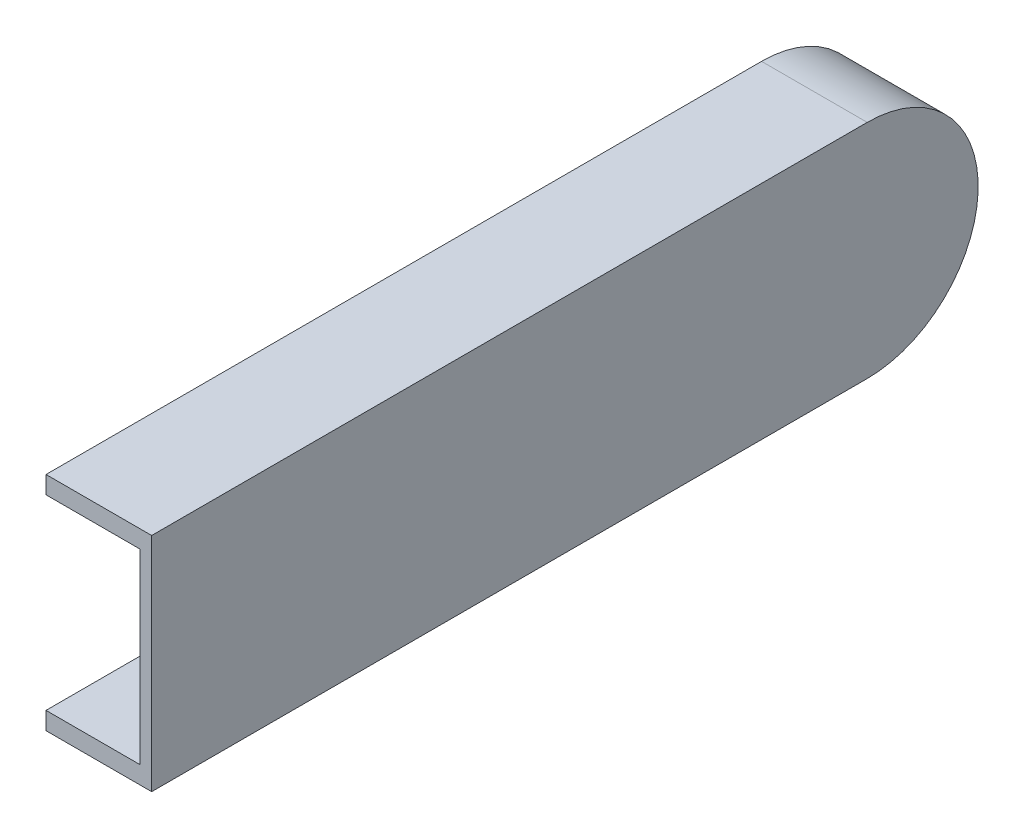
ISO-10303-21;
HEADER;
FILE_DESCRIPTION(('STEP AP214'),'2;1');
FILE_NAME('part.step','',(''),(''),'','','');
FILE_SCHEMA(('AUTOMOTIVE_DESIGN { 1 0 10303 214 1 1 1 1 }'));
ENDSEC;
DATA;
#1=APPLICATION_CONTEXT('core data for automotive mechanical design processes');
#2=APPLICATION_PROTOCOL_DEFINITION('international standard','automotive_design',2000,#1);
#3=PRODUCT_CONTEXT('',#1,'mechanical');
#4=PRODUCT('Part','Part','',(#3));
#5=PRODUCT_RELATED_PRODUCT_CATEGORY('part','',(#4));
#6=PRODUCT_DEFINITION_FORMATION('','',#4);
#7=PRODUCT_DEFINITION_CONTEXT('part definition',#1,'design');
#8=PRODUCT_DEFINITION('design','',#6,#7);
#9=PRODUCT_DEFINITION_SHAPE('','',#8);
#10=(LENGTH_UNIT() NAMED_UNIT(*) SI_UNIT(.MILLI.,.METRE.));
#11=(NAMED_UNIT(*) PLANE_ANGLE_UNIT() SI_UNIT($,.RADIAN.));
#12=(NAMED_UNIT(*) SI_UNIT($,.STERADIAN.) SOLID_ANGLE_UNIT());
#13=UNCERTAINTY_MEASURE_WITH_UNIT(LENGTH_MEASURE(1.E-05),#10,'distance_accuracy_value','');
#14=(GEOMETRIC_REPRESENTATION_CONTEXT(3) GLOBAL_UNCERTAINTY_ASSIGNED_CONTEXT((#13)) GLOBAL_UNIT_ASSIGNED_CONTEXT((#10,
#11,#12)) REPRESENTATION_CONTEXT('',''));
#15=CARTESIAN_POINT('',(0.,0.,0.));
#16=DIRECTION('',(0.,0.,1.));
#17=DIRECTION('',(1.,0.,0.));
#18=AXIS2_PLACEMENT_3D('',#15,#16,#17);
#19=CARTESIAN_POINT('',(0.,0.,30.474082362107));
#20=DIRECTION('',(1.,0.,0.));
#21=DIRECTION('',(0.,0.,-1.));
#22=AXIS2_PLACEMENT_3D('',#19,#20,#21);
#23=PLANE('',#22);
#24=DIRECTION('',(0.,0.,-1.));
#25=VECTOR('',#24,1.);
#26=CARTESIAN_POINT('',(0.,-9.45000000000007,30.474082362107));
#27=LINE('',#26,#25);
#28=CARTESIAN_POINT('',(0.,-9.45000000000007,30.4740823621069));
#29=VERTEX_POINT('',#28);
#30=CARTESIAN_POINT('',(0.,-9.45000000000001,-30.474082362107));
#31=VERTEX_POINT('',#30);
#32=EDGE_CURVE('E121',#29,#31,#27,.T.);
#33=ORIENTED_EDGE('',*,*,#32,.F.);
#34=DIRECTION('',(0.,1.,0.));
#35=VECTOR('',#34,1.);
#36=CARTESIAN_POINT('',(0.,9.45000000000004,30.4740823621069));
#37=LINE('',#36,#35);
#38=CARTESIAN_POINT('',(0.,-7.95000000000007,30.4740823621069));
#39=VERTEX_POINT('',#38);
#40=EDGE_CURVE('E108',#29,#39,#37,.T.);
#41=ORIENTED_EDGE('',*,*,#40,.T.);
#42=DIRECTION('',(0.,0.,-1.));
#43=VECTOR('',#42,1.);
#44=CARTESIAN_POINT('',(0.,-7.95000000000007,30.474082362107));
#45=LINE('',#44,#43);
#46=CARTESIAN_POINT('',(0.,-7.95000000000001,-30.474082362107));
#47=VERTEX_POINT('',#46);
#48=EDGE_CURVE('E146',#39,#47,#45,.T.);
#49=ORIENTED_EDGE('',*,*,#48,.T.);
#50=CARTESIAN_POINT('',(0.,0.,-30.474082362107));
#51=DIRECTION('',(1.,0.,0.));
#52=DIRECTION('',(0.,0.,-1.));
#53=AXIS2_PLACEMENT_3D('',#50,#51,#52);
#54=CIRCLE('',#53,7.95000000000001);
#55=CARTESIAN_POINT('',(0.,7.95000000000002,-30.474082362107));
#56=VERTEX_POINT('',#55);
#57=EDGE_CURVE('E157',#47,#56,#54,.T.);
#58=ORIENTED_EDGE('',*,*,#57,.T.);
#59=DIRECTION('',(0.,0.,1.));
#60=VECTOR('',#59,1.);
#61=CARTESIAN_POINT('',(0.,7.95000000000002,-30.474082362107));
#62=LINE('',#61,#60);
#63=CARTESIAN_POINT('',(0.,7.95000000000007,30.4740823621069));
#64=VERTEX_POINT('',#63);
#65=EDGE_CURVE('E151',#56,#64,#62,.T.);
#66=ORIENTED_EDGE('',*,*,#65,.T.);
#67=CARTESIAN_POINT('',(0.,9.45000000000004,30.4740823621069));
#68=VERTEX_POINT('',#67);
#69=EDGE_CURVE('E119',#64,#68,#37,.T.);
#70=ORIENTED_EDGE('',*,*,#69,.T.);
#71=DIRECTION('',(0.,0.,1.));
#72=VECTOR('',#71,1.);
#73=CARTESIAN_POINT('',(0.,9.45000000000002,-30.474082362107));
#74=LINE('',#73,#72);
#75=CARTESIAN_POINT('',(0.,9.45000000000002,-30.474082362107));
#76=VERTEX_POINT('',#75);
#77=EDGE_CURVE('E170',#76,#68,#74,.T.);
#78=ORIENTED_EDGE('',*,*,#77,.F.);
#79=CARTESIAN_POINT('',(0.,0.,-30.474082362107));
#80=DIRECTION('',(1.,0.,0.));
#81=DIRECTION('',(0.,0.,-1.));
#82=AXIS2_PLACEMENT_3D('',#79,#80,#81);
#83=CIRCLE('',#82,9.45000000000001);
#84=EDGE_CURVE('E66',#31,#76,#83,.T.);
#85=ORIENTED_EDGE('',*,*,#84,.F.);
#86=EDGE_LOOP('',(#33,#41,#49,#58,#66,#70,#78,#85));
#87=FACE_BOUND('',#86,.T.);
#88=ADVANCED_FACE('F41',(#87),#23,.F.);
#89=CARTESIAN_POINT('',(8.,-9.45000000000007,30.474082362107));
#90=DIRECTION('',(0.,1.,0.));
#91=DIRECTION('',(0.,0.,1.));
#92=AXIS2_PLACEMENT_3D('',#89,#90,#91);
#93=PLANE('',#92);
#94=ORIENTED_EDGE('',*,*,#32,.T.);
#95=DIRECTION('',(-1.,0.,0.));
#96=VECTOR('',#95,1.);
#97=CARTESIAN_POINT('',(8.,-9.45000000000001,-30.474082362107));
#98=LINE('',#97,#96);
#99=CARTESIAN_POINT('',(9.,-9.45000000000001,-30.474082362107));
#100=VERTEX_POINT('',#99);
#101=EDGE_CURVE('E128',#100,#31,#98,.T.);
#102=ORIENTED_EDGE('',*,*,#101,.F.);
#103=DIRECTION('',(0.,0.,-1.));
#104=VECTOR('',#103,1.);
#105=CARTESIAN_POINT('',(9.,-9.45000000000007,30.474082362107));
#106=LINE('',#105,#104);
#107=CARTESIAN_POINT('',(9.000012,-9.45000000000007,30.4740823621069));
#108=VERTEX_POINT('',#107);
#109=EDGE_CURVE('E127',#108,#100,#106,.T.);
#110=ORIENTED_EDGE('',*,*,#109,.F.);
#111=DIRECTION('',(-1.,0.,0.));
#112=VECTOR('',#111,1.);
#113=CARTESIAN_POINT('',(8.,-9.45000000000007,30.474082362107));
#114=LINE('',#113,#112);
#115=EDGE_CURVE('E50',#108,#29,#114,.T.);
#116=ORIENTED_EDGE('',*,*,#115,.T.);
#117=EDGE_LOOP('',(#94,#102,#110,#116));
#118=FACE_BOUND('',#117,.T.);
#119=ADVANCED_FACE('F43',(#118),#93,.F.);
#120=CARTESIAN_POINT('',(8.,0.,-30.474082362107));
#121=DIRECTION('',(-1.,0.,0.));
#122=DIRECTION('',(0.,0.,1.));
#123=AXIS2_PLACEMENT_3D('',#120,#121,#122);
#124=CYLINDRICAL_SURFACE('',#123,9.45000000000001);
#125=ORIENTED_EDGE('',*,*,#84,.T.);
#126=DIRECTION('',(-1.,0.,0.));
#127=VECTOR('',#126,1.);
#128=CARTESIAN_POINT('',(8.,9.45000000000002,-30.474082362107));
#129=LINE('',#128,#127);
#130=CARTESIAN_POINT('',(9.,9.45000000000002,-30.474082362107));
#131=VERTEX_POINT('',#130);
#132=EDGE_CURVE('E130',#131,#76,#129,.T.);
#133=ORIENTED_EDGE('',*,*,#132,.F.);
#134=CARTESIAN_POINT('',(9.,0.,-30.474082362107));
#135=DIRECTION('',(1.,0.,0.));
#136=DIRECTION('',(0.,0.,-1.));
#137=AXIS2_PLACEMENT_3D('',#134,#135,#136);
#138=CIRCLE('',#137,9.45000000000001);
#139=EDGE_CURVE('E135',#100,#131,#138,.T.);
#140=ORIENTED_EDGE('',*,*,#139,.F.);
#141=ORIENTED_EDGE('',*,*,#101,.T.);
#142=EDGE_LOOP('',(#125,#133,#140,#141));
#143=FACE_BOUND('',#142,.T.);
#144=ADVANCED_FACE('F199',(#143),#124,.T.);
#145=CARTESIAN_POINT('',(8.,9.45000000000002,-30.474082362107));
#146=DIRECTION('',(0.,-1.,0.));
#147=DIRECTION('',(0.,0.,-1.));
#148=AXIS2_PLACEMENT_3D('',#145,#146,#147);
#149=PLANE('',#148);
#150=ORIENTED_EDGE('',*,*,#77,.T.);
#151=DIRECTION('',(-1.,0.,0.));
#152=VECTOR('',#151,1.);
#153=CARTESIAN_POINT('',(8.,9.45000000000007,30.474082362107));
#154=LINE('',#153,#152);
#155=CARTESIAN_POINT('',(9.,9.45000000000004,30.4740823621069));
#156=VERTEX_POINT('',#155);
#157=EDGE_CURVE('E173',#156,#68,#154,.T.);
#158=ORIENTED_EDGE('',*,*,#157,.F.);
#159=DIRECTION('',(0.,0.,1.));
#160=VECTOR('',#159,1.);
#161=CARTESIAN_POINT('',(9.,9.45000000000002,-30.474082362107));
#162=LINE('',#161,#160);
#163=EDGE_CURVE('E139',#131,#156,#162,.T.);
#164=ORIENTED_EDGE('',*,*,#163,.F.);
#165=ORIENTED_EDGE('',*,*,#132,.T.);
#166=EDGE_LOOP('',(#150,#158,#164,#165));
#167=FACE_BOUND('',#166,.T.);
#168=ADVANCED_FACE('F178',(#167),#149,.F.);
#169=CARTESIAN_POINT('',(8.,-7.95000000000007,30.474082362107));
#170=DIRECTION('',(0.,1.,0.));
#171=DIRECTION('',(0.,0.,1.));
#172=AXIS2_PLACEMENT_3D('',#169,#170,#171);
#173=PLANE('',#172);
#174=ORIENTED_EDGE('',*,*,#48,.F.);
#175=DIRECTION('',(-1.,0.,0.));
#176=VECTOR('',#175,1.);
#177=CARTESIAN_POINT('',(8.,-7.95000000000007,30.474082362107));
#178=LINE('',#177,#176);
#179=CARTESIAN_POINT('',(8.,-7.95000000000007,30.4740823621069));
#180=VERTEX_POINT('',#179);
#181=EDGE_CURVE('E114',#180,#39,#178,.T.);
#182=ORIENTED_EDGE('',*,*,#181,.F.);
#183=DIRECTION('',(0.,0.,-1.));
#184=VECTOR('',#183,1.);
#185=CARTESIAN_POINT('',(8.,-7.95000000000007,30.474082362107));
#186=LINE('',#185,#184);
#187=CARTESIAN_POINT('',(8.,-7.95000000000001,-30.474082362107));
#188=VERTEX_POINT('',#187);
#189=EDGE_CURVE('E147',#180,#188,#186,.T.);
#190=ORIENTED_EDGE('',*,*,#189,.T.);
#191=DIRECTION('',(-1.,0.,0.));
#192=VECTOR('',#191,1.);
#193=CARTESIAN_POINT('',(8.,-7.95000000000001,-30.474082362107));
#194=LINE('',#193,#192);
#195=EDGE_CURVE('E166',#188,#47,#194,.T.);
#196=ORIENTED_EDGE('',*,*,#195,.T.);
#197=EDGE_LOOP('',(#174,#182,#190,#196));
#198=FACE_BOUND('',#197,.T.);
#199=ADVANCED_FACE('F190',(#198),#173,.T.);
#200=CARTESIAN_POINT('',(8.,0.,-30.474082362107));
#201=DIRECTION('',(-1.,0.,0.));
#202=DIRECTION('',(0.,0.,1.));
#203=AXIS2_PLACEMENT_3D('',#200,#201,#202);
#204=CYLINDRICAL_SURFACE('',#203,7.95000000000001);
#205=ORIENTED_EDGE('',*,*,#57,.F.);
#206=ORIENTED_EDGE('',*,*,#195,.F.);
#207=CARTESIAN_POINT('',(8.,0.,-30.474082362107));
#208=DIRECTION('',(1.,0.,0.));
#209=DIRECTION('',(0.,0.,-1.));
#210=AXIS2_PLACEMENT_3D('',#207,#208,#209);
#211=CIRCLE('',#210,7.95000000000001);
#212=CARTESIAN_POINT('',(8.,7.95000000000002,-30.474082362107));
#213=VERTEX_POINT('',#212);
#214=EDGE_CURVE('E150',#188,#213,#211,.T.);
#215=ORIENTED_EDGE('',*,*,#214,.T.);
#216=DIRECTION('',(-1.,0.,0.));
#217=VECTOR('',#216,1.);
#218=CARTESIAN_POINT('',(8.,7.95000000000002,-30.474082362107));
#219=LINE('',#218,#217);
#220=EDGE_CURVE('E164',#213,#56,#219,.T.);
#221=ORIENTED_EDGE('',*,*,#220,.T.);
#222=EDGE_LOOP('',(#205,#206,#215,#221));
#223=FACE_BOUND('',#222,.T.);
#224=ADVANCED_FACE('F187',(#223),#204,.F.);
#225=CARTESIAN_POINT('',(8.,7.95000000000002,-30.474082362107));
#226=DIRECTION('',(0.,-1.,0.));
#227=DIRECTION('',(0.,0.,-1.));
#228=AXIS2_PLACEMENT_3D('',#225,#226,#227);
#229=PLANE('',#228);
#230=ORIENTED_EDGE('',*,*,#65,.F.);
#231=ORIENTED_EDGE('',*,*,#220,.F.);
#232=DIRECTION('',(0.,0.,1.));
#233=VECTOR('',#232,1.);
#234=CARTESIAN_POINT('',(8.,7.95000000000002,-30.474082362107));
#235=LINE('',#234,#233);
#236=CARTESIAN_POINT('',(8.,7.95000000000007,30.4740823621069));
#237=VERTEX_POINT('',#236);
#238=EDGE_CURVE('E58',#213,#237,#235,.T.);
#239=ORIENTED_EDGE('',*,*,#238,.T.);
#240=DIRECTION('',(-1.,0.,0.));
#241=VECTOR('',#240,1.);
#242=CARTESIAN_POINT('',(8.,7.95000000000007,30.474082362107));
#243=LINE('',#242,#241);
#244=EDGE_CURVE('E155',#237,#64,#243,.T.);
#245=ORIENTED_EDGE('',*,*,#244,.T.);
#246=EDGE_LOOP('',(#230,#231,#239,#245));
#247=FACE_BOUND('',#246,.T.);
#248=ADVANCED_FACE('F183',(#247),#229,.T.);
#249=CARTESIAN_POINT('',(8.,0.,30.474082362107));
#250=DIRECTION('',(1.,0.,0.));
#251=DIRECTION('',(0.,0.,-1.));
#252=AXIS2_PLACEMENT_3D('',#249,#250,#251);
#253=PLANE('',#252);
#254=ORIENTED_EDGE('',*,*,#189,.F.);
#255=DIRECTION('',(0.,1.,0.));
#256=VECTOR('',#255,1.);
#257=CARTESIAN_POINT('',(8.,0.,30.4740823621069));
#258=LINE('',#257,#256);
#259=EDGE_CURVE('E118',#180,#237,#258,.T.);
#260=ORIENTED_EDGE('',*,*,#259,.T.);
#261=ORIENTED_EDGE('',*,*,#238,.F.);
#262=ORIENTED_EDGE('',*,*,#214,.F.);
#263=EDGE_LOOP('',(#254,#260,#261,#262));
#264=FACE_BOUND('',#263,.T.);
#265=ADVANCED_FACE('F188',(#264),#253,.F.);
#266=CARTESIAN_POINT('',(9.,0.,30.474082362107));
#267=DIRECTION('',(1.,0.,0.));
#268=DIRECTION('',(0.,0.,-1.));
#269=AXIS2_PLACEMENT_3D('',#266,#267,#268);
#270=PLANE('',#269);
#271=DIRECTION('',(0.,1.,0.));
#272=VECTOR('',#271,1.);
#273=CARTESIAN_POINT('',(9.,0.,30.4740823621069));
#274=LINE('',#273,#272);
#275=EDGE_CURVE('E11',#108,#156,#274,.T.);
#276=ORIENTED_EDGE('',*,*,#275,.F.);
#277=ORIENTED_EDGE('',*,*,#109,.T.);
#278=ORIENTED_EDGE('',*,*,#139,.T.);
#279=ORIENTED_EDGE('',*,*,#163,.T.);
#280=EDGE_LOOP('',(#276,#277,#278,#279));
#281=FACE_BOUND('',#280,.T.);
#282=ADVANCED_FACE('F250',(#281),#270,.T.);
#283=CARTESIAN_POINT('',(0.,9.45000000000004,30.4740823621069));
#284=DIRECTION('',(0.,0.,-1.));
#285=DIRECTION('',(0.,1.,0.));
#286=AXIS2_PLACEMENT_3D('',#283,#284,#285);
#287=PLANE('',#286);
#288=ORIENTED_EDGE('',*,*,#181,.T.);
#289=ORIENTED_EDGE('',*,*,#40,.F.);
#290=ORIENTED_EDGE('',*,*,#115,.F.);
#291=ORIENTED_EDGE('',*,*,#275,.T.);
#292=ORIENTED_EDGE('',*,*,#157,.T.);
#293=ORIENTED_EDGE('',*,*,#69,.F.);
#294=ORIENTED_EDGE('',*,*,#244,.F.);
#295=ORIENTED_EDGE('',*,*,#259,.F.);
#296=EDGE_LOOP('',(#288,#289,#290,#291,#292,#293,#294,#295));
#297=FACE_BOUND('',#296,.T.);
#298=ADVANCED_FACE('F110',(#297),#287,.F.);
#299=CLOSED_SHELL('',(#88,#119,#144,#168,#199,#224,#248,#265,#282,#298));
#300=MANIFOLD_SOLID_BREP('B2',#299);
#301=ADVANCED_BREP_SHAPE_REPRESENTATION('',(#18,#300),#14);
#302=SHAPE_DEFINITION_REPRESENTATION(#9,#301);
ENDSEC;
END-ISO-10303-21;
